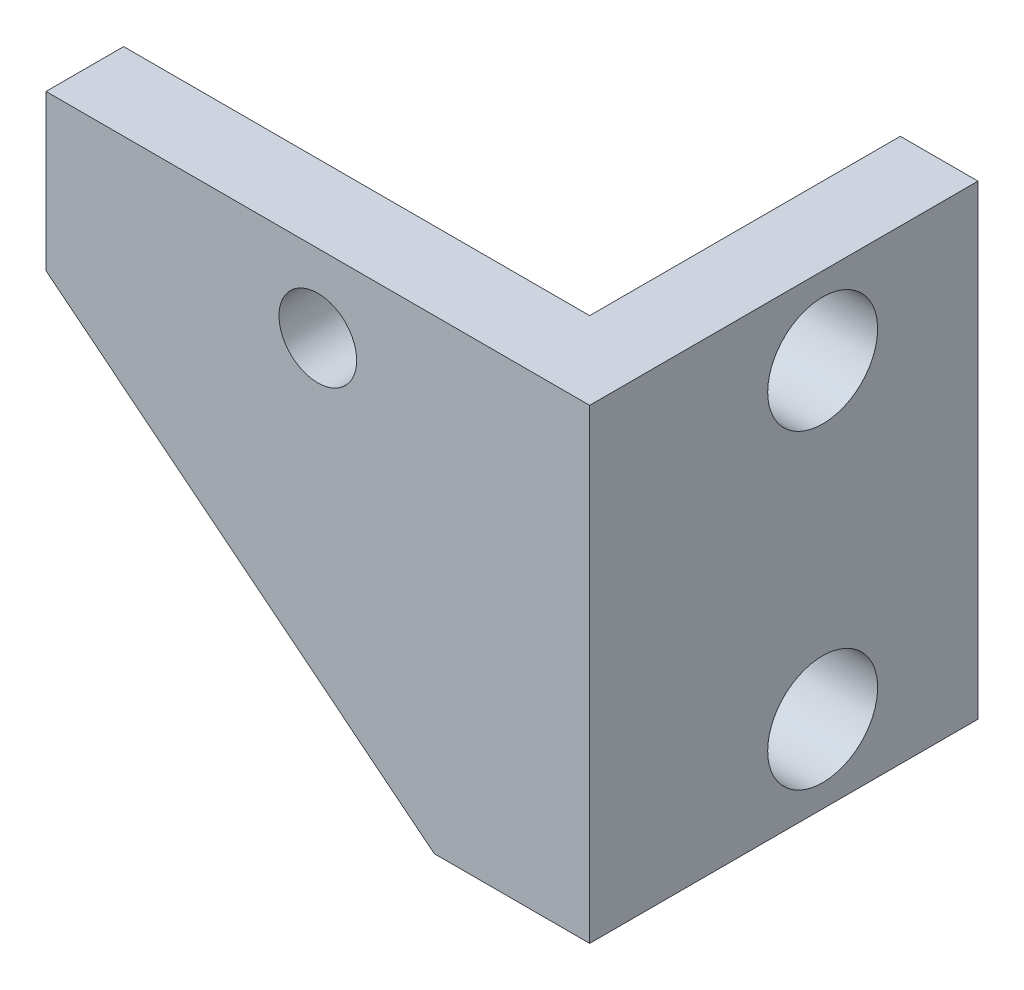
ISO-10303-21;
HEADER;
FILE_DESCRIPTION(('STEP AP214'),'2;1');
FILE_NAME('part.step','',(''),(''),'','','');
FILE_SCHEMA(('AUTOMOTIVE_DESIGN { 1 0 10303 214 1 1 1 1 }'));
ENDSEC;
DATA;
#1=APPLICATION_CONTEXT('core data for automotive mechanical design processes');
#2=APPLICATION_PROTOCOL_DEFINITION('international standard','automotive_design',2000,#1);
#3=PRODUCT_CONTEXT('',#1,'mechanical');
#4=PRODUCT('Part','Part','',(#3));
#5=PRODUCT_RELATED_PRODUCT_CATEGORY('part','',(#4));
#6=PRODUCT_DEFINITION_FORMATION('','',#4);
#7=PRODUCT_DEFINITION_CONTEXT('part definition',#1,'design');
#8=PRODUCT_DEFINITION('design','',#6,#7);
#9=PRODUCT_DEFINITION_SHAPE('','',#8);
#10=(LENGTH_UNIT() NAMED_UNIT(*) SI_UNIT(.MILLI.,.METRE.));
#11=(NAMED_UNIT(*) PLANE_ANGLE_UNIT() SI_UNIT($,.RADIAN.));
#12=(NAMED_UNIT(*) SI_UNIT($,.STERADIAN.) SOLID_ANGLE_UNIT());
#13=UNCERTAINTY_MEASURE_WITH_UNIT(LENGTH_MEASURE(1.E-05),#10,'distance_accuracy_value','');
#14=(GEOMETRIC_REPRESENTATION_CONTEXT(3) GLOBAL_UNCERTAINTY_ASSIGNED_CONTEXT((#13)) GLOBAL_UNIT_ASSIGNED_CONTEXT((#10,
#11,#12)) REPRESENTATION_CONTEXT('',''));
#15=CARTESIAN_POINT('',(0.,0.,0.));
#16=DIRECTION('',(0.,0.,1.));
#17=DIRECTION('',(1.,0.,0.));
#18=AXIS2_PLACEMENT_3D('',#15,#16,#17);
#19=CARTESIAN_POINT('',(0.,-19.05,3.175));
#20=DIRECTION('',(-1.,0.,0.));
#21=DIRECTION('',(0.,0.,1.));
#22=AXIS2_PLACEMENT_3D('',#19,#20,#21);
#23=PLANE('',#22);
#24=CARTESIAN_POINT('',(0.,-3.175,-6.35));
#25=DIRECTION('',(-1.,0.,0.));
#26=DIRECTION('',(0.,0.,1.));
#27=AXIS2_PLACEMENT_3D('',#24,#25,#26);
#28=CIRCLE('',#27,2.2479);
#29=CARTESIAN_POINT('',(0.,-3.175,-4.1021));
#30=VERTEX_POINT('',#29);
#31=EDGE_CURVE('E196',#30,#30,#28,.T.);
#32=ORIENTED_EDGE('',*,*,#31,.T.);
#33=EDGE_LOOP('',(#32));
#34=FACE_BOUND('',#33,.T.);
#35=CARTESIAN_POINT('',(0.,-15.875,-6.35));
#36=DIRECTION('',(-1.,0.,0.));
#37=DIRECTION('',(0.,0.,1.));
#38=AXIS2_PLACEMENT_3D('',#35,#36,#37);
#39=CIRCLE('',#38,2.2479);
#40=CARTESIAN_POINT('',(0.,-15.875,-4.1021));
#41=VERTEX_POINT('',#40);
#42=EDGE_CURVE('E148',#41,#41,#39,.T.);
#43=ORIENTED_EDGE('',*,*,#42,.T.);
#44=EDGE_LOOP('',(#43));
#45=FACE_BOUND('',#44,.T.);
#46=DIRECTION('',(0.,0.,-1.));
#47=VECTOR('',#46,1.);
#48=CARTESIAN_POINT('',(0.,-19.05,3.175));
#49=LINE('',#48,#47);
#50=CARTESIAN_POINT('',(0.,-19.05,3.175));
#51=VERTEX_POINT('',#50);
#52=CARTESIAN_POINT('',(0.,-19.05,-12.7));
#53=VERTEX_POINT('',#52);
#54=EDGE_CURVE('E111',#51,#53,#49,.T.);
#55=ORIENTED_EDGE('',*,*,#54,.T.);
#56=DIRECTION('',(0.,1.,0.));
#57=VECTOR('',#56,1.);
#58=CARTESIAN_POINT('',(0.,0.,-12.7));
#59=LINE('',#58,#57);
#60=CARTESIAN_POINT('',(0.,0.,-12.7));
#61=VERTEX_POINT('',#60);
#62=EDGE_CURVE('E143',#53,#61,#59,.T.);
#63=ORIENTED_EDGE('',*,*,#62,.T.);
#64=DIRECTION('',(0.,0.,-1.));
#65=VECTOR('',#64,1.);
#66=CARTESIAN_POINT('',(0.,0.,3.175));
#67=LINE('',#66,#65);
#68=CARTESIAN_POINT('',(0.,0.,3.175));
#69=VERTEX_POINT('',#68);
#70=EDGE_CURVE('E45',#69,#61,#67,.T.);
#71=ORIENTED_EDGE('',*,*,#70,.F.);
#72=DIRECTION('',(0.,1.,0.));
#73=VECTOR('',#72,1.);
#74=CARTESIAN_POINT('',(0.,-19.05,3.175));
#75=LINE('',#74,#73);
#76=EDGE_CURVE('E123',#51,#69,#75,.T.);
#77=ORIENTED_EDGE('',*,*,#76,.F.);
#78=EDGE_LOOP('',(#55,#63,#71,#77));
#79=FACE_BOUND('',#78,.T.);
#80=ADVANCED_FACE('F38',(#34,#45,#79),#23,.F.);
#81=CARTESIAN_POINT('',(0.,0.,3.175));
#82=DIRECTION('',(0.,-1.,0.));
#83=DIRECTION('',(1.,0.,0.));
#84=AXIS2_PLACEMENT_3D('',#81,#82,#83);
#85=PLANE('',#84);
#86=DIRECTION('',(0.,0.,-1.));
#87=VECTOR('',#86,1.);
#88=CARTESIAN_POINT('',(-22.225,0.,3.175));
#89=LINE('',#88,#87);
#90=CARTESIAN_POINT('',(-22.225,0.,3.175));
#91=VERTEX_POINT('',#90);
#92=CARTESIAN_POINT('',(-22.225,0.,0.));
#93=VERTEX_POINT('',#92);
#94=EDGE_CURVE('E106',#91,#93,#89,.T.);
#95=ORIENTED_EDGE('',*,*,#94,.F.);
#96=DIRECTION('',(-1.,0.,0.));
#97=VECTOR('',#96,1.);
#98=CARTESIAN_POINT('',(0.,0.,3.175));
#99=LINE('',#98,#97);
#100=EDGE_CURVE('E87',#69,#91,#99,.T.);
#101=ORIENTED_EDGE('',*,*,#100,.F.);
#102=ORIENTED_EDGE('',*,*,#70,.T.);
#103=DIRECTION('',(-1.,0.,0.));
#104=VECTOR('',#103,1.);
#105=CARTESIAN_POINT('',(0.,0.,-12.7));
#106=LINE('',#105,#104);
#107=CARTESIAN_POINT('',(-3.175,0.,-12.7));
#108=VERTEX_POINT('',#107);
#109=EDGE_CURVE('E132',#61,#108,#106,.T.);
#110=ORIENTED_EDGE('',*,*,#109,.T.);
#111=DIRECTION('',(0.,0.,1.));
#112=VECTOR('',#111,1.);
#113=CARTESIAN_POINT('',(-3.175,0.,-12.7));
#114=LINE('',#113,#112);
#115=CARTESIAN_POINT('',(-3.175,0.,0.));
#116=VERTEX_POINT('',#115);
#117=EDGE_CURVE('E52',#108,#116,#114,.T.);
#118=ORIENTED_EDGE('',*,*,#117,.T.);
#119=DIRECTION('',(-1.,0.,0.));
#120=VECTOR('',#119,1.);
#121=CARTESIAN_POINT('',(0.,0.,0.));
#122=LINE('',#121,#120);
#123=EDGE_CURVE('E115',#116,#93,#122,.T.);
#124=ORIENTED_EDGE('',*,*,#123,.T.);
#125=EDGE_LOOP('',(#95,#101,#102,#110,#118,#124));
#126=FACE_BOUND('',#125,.T.);
#127=ADVANCED_FACE('F130',(#126),#85,.F.);
#128=CARTESIAN_POINT('',(-22.225,0.,3.175));
#129=DIRECTION('',(1.,0.,0.));
#130=DIRECTION('',(0.,0.,-1.));
#131=AXIS2_PLACEMENT_3D('',#128,#129,#130);
#132=PLANE('',#131);
#133=DIRECTION('',(0.,-1.,0.));
#134=VECTOR('',#133,1.);
#135=CARTESIAN_POINT('',(-22.225,0.,0.));
#136=LINE('',#135,#134);
#137=CARTESIAN_POINT('',(-22.225,-6.35,0.));
#138=VERTEX_POINT('',#137);
#139=EDGE_CURVE('E105',#93,#138,#136,.T.);
#140=ORIENTED_EDGE('',*,*,#139,.T.);
#141=DIRECTION('',(0.,0.,-1.));
#142=VECTOR('',#141,1.);
#143=CARTESIAN_POINT('',(-22.225,-6.35,3.175));
#144=LINE('',#143,#142);
#145=CARTESIAN_POINT('',(-22.225,-6.35,3.175));
#146=VERTEX_POINT('',#145);
#147=EDGE_CURVE('E102',#146,#138,#144,.T.);
#148=ORIENTED_EDGE('',*,*,#147,.F.);
#149=DIRECTION('',(0.,-1.,0.));
#150=VECTOR('',#149,1.);
#151=CARTESIAN_POINT('',(-22.225,0.,3.175));
#152=LINE('',#151,#150);
#153=EDGE_CURVE('E93',#91,#146,#152,.T.);
#154=ORIENTED_EDGE('',*,*,#153,.F.);
#155=ORIENTED_EDGE('',*,*,#94,.T.);
#156=EDGE_LOOP('',(#140,#148,#154,#155));
#157=FACE_BOUND('',#156,.T.);
#158=ADVANCED_FACE('F103',(#157),#132,.F.);
#159=CARTESIAN_POINT('',(-22.225,-6.35,3.175));
#160=DIRECTION('',(0.624695047554424,0.78086880944303,0.));
#161=DIRECTION('',(-0.78086880944303,0.624695047554424,0.));
#162=AXIS2_PLACEMENT_3D('',#159,#160,#161);
#163=PLANE('',#162);
#164=DIRECTION('',(0.78086880944303,-0.624695047554424,0.));
#165=VECTOR('',#164,1.);
#166=CARTESIAN_POINT('',(-22.225,-6.35,0.));
#167=LINE('',#166,#165);
#168=CARTESIAN_POINT('',(-6.35,-19.05,0.));
#169=VERTEX_POINT('',#168);
#170=EDGE_CURVE('E79',#138,#169,#167,.T.);
#171=ORIENTED_EDGE('',*,*,#170,.T.);
#172=DIRECTION('',(0.,0.,-1.));
#173=VECTOR('',#172,1.);
#174=CARTESIAN_POINT('',(-6.35,-19.05,3.175));
#175=LINE('',#174,#173);
#176=CARTESIAN_POINT('',(-6.35,-19.05,3.175));
#177=VERTEX_POINT('',#176);
#178=EDGE_CURVE('E107',#177,#169,#175,.T.);
#179=ORIENTED_EDGE('',*,*,#178,.F.);
#180=DIRECTION('',(0.78086880944303,-0.624695047554424,0.));
#181=VECTOR('',#180,1.);
#182=CARTESIAN_POINT('',(-22.225,-6.35,3.175));
#183=LINE('',#182,#181);
#184=EDGE_CURVE('E98',#146,#177,#183,.T.);
#185=ORIENTED_EDGE('',*,*,#184,.F.);
#186=ORIENTED_EDGE('',*,*,#147,.T.);
#187=EDGE_LOOP('',(#171,#179,#185,#186));
#188=FACE_BOUND('',#187,.T.);
#189=ADVANCED_FACE('F109',(#188),#163,.F.);
#190=CARTESIAN_POINT('',(-6.35,-19.05,3.175));
#191=DIRECTION('',(0.,1.,0.));
#192=DIRECTION('',(0.,0.,1.));
#193=AXIS2_PLACEMENT_3D('',#190,#191,#192);
#194=PLANE('',#193);
#195=DIRECTION('',(1.,0.,0.));
#196=VECTOR('',#195,1.);
#197=CARTESIAN_POINT('',(-6.35,-19.05,0.));
#198=LINE('',#197,#196);
#199=CARTESIAN_POINT('',(-3.175,-19.05,0.));
#200=VERTEX_POINT('',#199);
#201=EDGE_CURVE('E120',#169,#200,#198,.T.);
#202=ORIENTED_EDGE('',*,*,#201,.T.);
#203=DIRECTION('',(0.,0.,1.));
#204=VECTOR('',#203,1.);
#205=CARTESIAN_POINT('',(-3.175,-19.05,-12.7));
#206=LINE('',#205,#204);
#207=CARTESIAN_POINT('',(-3.175,-19.05,-12.7));
#208=VERTEX_POINT('',#207);
#209=EDGE_CURVE('E158',#208,#200,#206,.T.);
#210=ORIENTED_EDGE('',*,*,#209,.F.);
#211=DIRECTION('',(1.,0.,0.));
#212=VECTOR('',#211,1.);
#213=CARTESIAN_POINT('',(0.,-19.05,-12.7));
#214=LINE('',#213,#212);
#215=EDGE_CURVE('E156',#208,#53,#214,.T.);
#216=ORIENTED_EDGE('',*,*,#215,.T.);
#217=ORIENTED_EDGE('',*,*,#54,.F.);
#218=DIRECTION('',(1.,0.,0.));
#219=VECTOR('',#218,1.);
#220=CARTESIAN_POINT('',(-6.35,-19.05,3.175));
#221=LINE('',#220,#219);
#222=EDGE_CURVE('E61',#177,#51,#221,.T.);
#223=ORIENTED_EDGE('',*,*,#222,.F.);
#224=ORIENTED_EDGE('',*,*,#178,.T.);
#225=EDGE_LOOP('',(#202,#210,#216,#217,#223,#224));
#226=FACE_BOUND('',#225,.T.);
#227=ADVANCED_FACE('F179',(#226),#194,.F.);
#228=CARTESIAN_POINT('',(0.,0.,3.175));
#229=DIRECTION('',(0.,0.,1.));
#230=DIRECTION('',(1.,0.,0.));
#231=AXIS2_PLACEMENT_3D('',#228,#229,#230);
#232=PLANE('',#231);
#233=ORIENTED_EDGE('',*,*,#222,.T.);
#234=ORIENTED_EDGE('',*,*,#76,.T.);
#235=ORIENTED_EDGE('',*,*,#100,.T.);
#236=ORIENTED_EDGE('',*,*,#153,.T.);
#237=ORIENTED_EDGE('',*,*,#184,.T.);
#238=EDGE_LOOP('',(#233,#234,#235,#236,#237));
#239=FACE_BOUND('',#238,.T.);
#240=CARTESIAN_POINT('',(-11.1125,-3.175,3.175));
#241=DIRECTION('',(0.,0.,1.));
#242=DIRECTION('',(1.,0.,0.));
#243=AXIS2_PLACEMENT_3D('',#240,#241,#242);
#244=CIRCLE('',#243,1.58749999999999);
#245=CARTESIAN_POINT('',(-9.52500000000001,-3.175,3.175));
#246=VERTEX_POINT('',#245);
#247=EDGE_CURVE('E161',#246,#246,#244,.T.);
#248=ORIENTED_EDGE('',*,*,#247,.F.);
#249=EDGE_LOOP('',(#248));
#250=FACE_BOUND('',#249,.T.);
#251=ADVANCED_FACE('F95',(#239,#250),#232,.T.);
#252=CARTESIAN_POINT('',(0.,0.,0.));
#253=DIRECTION('',(0.,0.,1.));
#254=DIRECTION('',(1.,0.,0.));
#255=AXIS2_PLACEMENT_3D('',#252,#253,#254);
#256=PLANE('',#255);
#257=CARTESIAN_POINT('',(-11.1125,-3.175,0.));
#258=DIRECTION('',(0.,0.,1.));
#259=DIRECTION('',(1.,0.,0.));
#260=AXIS2_PLACEMENT_3D('',#257,#258,#259);
#261=CIRCLE('',#260,1.5875);
#262=CARTESIAN_POINT('',(-9.525,-3.175,0.));
#263=VERTEX_POINT('',#262);
#264=EDGE_CURVE('E117',#263,#263,#261,.T.);
#265=ORIENTED_EDGE('',*,*,#264,.T.);
#266=EDGE_LOOP('',(#265));
#267=FACE_BOUND('',#266,.T.);
#268=ORIENTED_EDGE('',*,*,#123,.F.);
#269=DIRECTION('',(0.,-1.,0.));
#270=VECTOR('',#269,1.);
#271=CARTESIAN_POINT('',(-3.175,0.,0.));
#272=LINE('',#271,#270);
#273=EDGE_CURVE('E11',#116,#200,#272,.T.);
#274=ORIENTED_EDGE('',*,*,#273,.T.);
#275=ORIENTED_EDGE('',*,*,#201,.F.);
#276=ORIENTED_EDGE('',*,*,#170,.F.);
#277=ORIENTED_EDGE('',*,*,#139,.F.);
#278=EDGE_LOOP('',(#268,#274,#275,#276,#277));
#279=FACE_BOUND('',#278,.T.);
#280=ADVANCED_FACE('F169',(#267,#279),#256,.F.);
#281=CARTESIAN_POINT('',(-11.1125,-3.175,3.175));
#282=DIRECTION('',(0.,0.,1.));
#283=DIRECTION('',(1.,0.,0.));
#284=AXIS2_PLACEMENT_3D('',#281,#282,#283);
#285=CYLINDRICAL_SURFACE('',#284,1.58749999999999);
#286=ORIENTED_EDGE('',*,*,#264,.F.);
#287=EDGE_LOOP('',(#286));
#288=FACE_BOUND('',#287,.T.);
#289=ORIENTED_EDGE('',*,*,#247,.T.);
#290=EDGE_LOOP('',(#289));
#291=FACE_BOUND('',#290,.T.);
#292=ADVANCED_FACE('F172',(#288,#291),#285,.F.);
#293=CARTESIAN_POINT('',(-3.175,0.,-12.7));
#294=DIRECTION('',(-1.,0.,0.));
#295=DIRECTION('',(0.,0.,1.));
#296=AXIS2_PLACEMENT_3D('',#293,#294,#295);
#297=PLANE('',#296);
#298=CARTESIAN_POINT('',(-3.175,-3.175,-6.35));
#299=DIRECTION('',(-1.,0.,0.));
#300=DIRECTION('',(0.,0.,1.));
#301=AXIS2_PLACEMENT_3D('',#298,#299,#300);
#302=CIRCLE('',#301,2.24789999999999);
#303=CARTESIAN_POINT('',(-3.175,-3.175,-4.10210000000001));
#304=VERTEX_POINT('',#303);
#305=EDGE_CURVE('E207',#304,#304,#302,.T.);
#306=ORIENTED_EDGE('',*,*,#305,.F.);
#307=EDGE_LOOP('',(#306));
#308=FACE_BOUND('',#307,.T.);
#309=CARTESIAN_POINT('',(-3.175,-15.875,-6.35));
#310=DIRECTION('',(-1.,0.,0.));
#311=DIRECTION('',(0.,0.,1.));
#312=AXIS2_PLACEMENT_3D('',#309,#310,#311);
#313=CIRCLE('',#312,2.24789999999999);
#314=CARTESIAN_POINT('',(-3.175,-15.875,-4.10210000000001));
#315=VERTEX_POINT('',#314);
#316=EDGE_CURVE('E151',#315,#315,#313,.T.);
#317=ORIENTED_EDGE('',*,*,#316,.F.);
#318=EDGE_LOOP('',(#317));
#319=FACE_BOUND('',#318,.T.);
#320=ORIENTED_EDGE('',*,*,#273,.F.);
#321=ORIENTED_EDGE('',*,*,#117,.F.);
#322=DIRECTION('',(0.,-1.,0.));
#323=VECTOR('',#322,1.);
#324=CARTESIAN_POINT('',(-3.175,0.,-12.7));
#325=LINE('',#324,#323);
#326=EDGE_CURVE('E146',#108,#208,#325,.T.);
#327=ORIENTED_EDGE('',*,*,#326,.T.);
#328=ORIENTED_EDGE('',*,*,#209,.T.);
#329=EDGE_LOOP('',(#320,#321,#327,#328));
#330=FACE_BOUND('',#329,.T.);
#331=ADVANCED_FACE('F175',(#308,#319,#330),#297,.T.);
#332=CARTESIAN_POINT('',(0.,0.,-12.7));
#333=DIRECTION('',(0.,0.,-1.));
#334=DIRECTION('',(-1.,0.,0.));
#335=AXIS2_PLACEMENT_3D('',#332,#333,#334);
#336=PLANE('',#335);
#337=ORIENTED_EDGE('',*,*,#62,.F.);
#338=ORIENTED_EDGE('',*,*,#215,.F.);
#339=ORIENTED_EDGE('',*,*,#326,.F.);
#340=ORIENTED_EDGE('',*,*,#109,.F.);
#341=EDGE_LOOP('',(#337,#338,#339,#340));
#342=FACE_BOUND('',#341,.T.);
#343=ADVANCED_FACE('F140',(#342),#336,.T.);
#344=CARTESIAN_POINT('',(-3.175,-15.875,-6.35));
#345=DIRECTION('',(-1.,0.,0.));
#346=DIRECTION('',(0.,0.,1.));
#347=AXIS2_PLACEMENT_3D('',#344,#345,#346);
#348=CYLINDRICAL_SURFACE('',#347,2.24789999999999);
#349=ORIENTED_EDGE('',*,*,#42,.F.);
#350=EDGE_LOOP('',(#349));
#351=FACE_BOUND('',#350,.T.);
#352=ORIENTED_EDGE('',*,*,#316,.T.);
#353=EDGE_LOOP('',(#352));
#354=FACE_BOUND('',#353,.T.);
#355=ADVANCED_FACE('F199',(#351,#354),#348,.F.);
#356=CARTESIAN_POINT('',(-3.175,-3.175,-6.35));
#357=DIRECTION('',(-1.,0.,0.));
#358=DIRECTION('',(0.,0.,1.));
#359=AXIS2_PLACEMENT_3D('',#356,#357,#358);
#360=CYLINDRICAL_SURFACE('',#359,2.24789999999999);
#361=ORIENTED_EDGE('',*,*,#31,.F.);
#362=EDGE_LOOP('',(#361));
#363=FACE_BOUND('',#362,.T.);
#364=ORIENTED_EDGE('',*,*,#305,.T.);
#365=EDGE_LOOP('',(#364));
#366=FACE_BOUND('',#365,.T.);
#367=ADVANCED_FACE('F202',(#363,#366),#360,.F.);
#368=CLOSED_SHELL('',(#80,#127,#158,#189,#227,#251,#280,#292,#331,#343,#355,#367));
#369=MANIFOLD_SOLID_BREP('B2',#368);
#370=ADVANCED_BREP_SHAPE_REPRESENTATION('',(#18,#369),#14);
#371=SHAPE_DEFINITION_REPRESENTATION(#9,#370);
ENDSEC;
END-ISO-10303-21;
